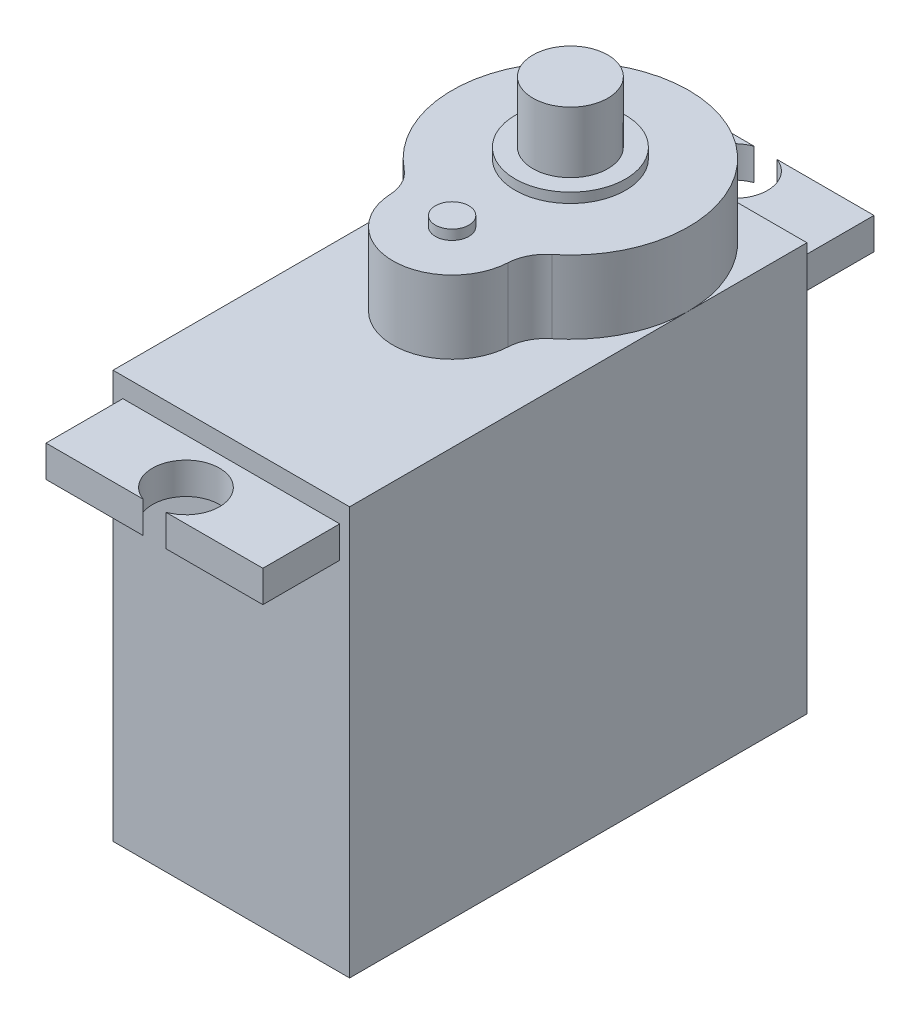
ISO-10303-21;
HEADER;
FILE_DESCRIPTION(('STEP AP214'),'2;1');
FILE_NAME('part.step','',(''),(''),'','','');
FILE_SCHEMA(('AUTOMOTIVE_DESIGN { 1 0 10303 214 1 1 1 1 }'));
ENDSEC;
DATA;
#1=APPLICATION_CONTEXT('core data for automotive mechanical design processes');
#2=APPLICATION_PROTOCOL_DEFINITION('international standard','automotive_design',2000,#1);
#3=PRODUCT_CONTEXT('',#1,'mechanical');
#4=PRODUCT('Part','Part','',(#3));
#5=PRODUCT_RELATED_PRODUCT_CATEGORY('part','',(#4));
#6=PRODUCT_DEFINITION_FORMATION('','',#4);
#7=PRODUCT_DEFINITION_CONTEXT('part definition',#1,'design');
#8=PRODUCT_DEFINITION('design','',#6,#7);
#9=PRODUCT_DEFINITION_SHAPE('','',#8);
#10=(LENGTH_UNIT() NAMED_UNIT(*) SI_UNIT(.MILLI.,.METRE.));
#11=(NAMED_UNIT(*) PLANE_ANGLE_UNIT() SI_UNIT($,.RADIAN.));
#12=(NAMED_UNIT(*) SI_UNIT($,.STERADIAN.) SOLID_ANGLE_UNIT());
#13=UNCERTAINTY_MEASURE_WITH_UNIT(LENGTH_MEASURE(1.E-05),#10,'distance_accuracy_value','');
#14=(GEOMETRIC_REPRESENTATION_CONTEXT(3) GLOBAL_UNCERTAINTY_ASSIGNED_CONTEXT((#13)) GLOBAL_UNIT_ASSIGNED_CONTEXT((#10,
#11,#12)) REPRESENTATION_CONTEXT('',''));
#15=CARTESIAN_POINT('',(0.,0.,0.));
#16=DIRECTION('',(0.,0.,1.));
#17=DIRECTION('',(1.,0.,0.));
#18=AXIS2_PLACEMENT_3D('',#15,#16,#17);
#19=CARTESIAN_POINT('',(4.98,4.2,-26.2));
#20=DIRECTION('',(0.,0.,-1.));
#21=DIRECTION('',(-1.,0.,0.));
#22=AXIS2_PLACEMENT_3D('',#19,#20,#21);
#23=PLANE('',#22);
#24=CARTESIAN_POINT('',(4.98,4.2,-26.2));
#25=DIRECTION('',(0.,0.,-1.));
#26=DIRECTION('',(-1.,0.,0.));
#27=AXIS2_PLACEMENT_3D('',#24,#25,#26);
#28=CIRCLE('',#27,0.500000000000002);
#29=CARTESIAN_POINT('',(4.48,4.2,-26.2));
#30=VERTEX_POINT('',#29);
#31=EDGE_CURVE('E11',#30,#30,#28,.T.);
#32=ORIENTED_EDGE('',*,*,#31,.T.);
#33=EDGE_LOOP('',(#32));
#34=FACE_BOUND('',#33,.T.);
#35=ADVANCED_FACE('F33',(#34),#23,.T.);
#36=CARTESIAN_POINT('',(4.98,4.2,-26.2));
#37=DIRECTION('',(0.,0.,1.));
#38=DIRECTION('',(1.,0.,0.));
#39=AXIS2_PLACEMENT_3D('',#36,#37,#38);
#40=CYLINDRICAL_SURFACE('',#39,0.500000000000002);
#41=ORIENTED_EDGE('',*,*,#31,.F.);
#42=EDGE_LOOP('',(#41));
#43=FACE_BOUND('',#42,.T.);
#44=CARTESIAN_POINT('',(4.98,4.2,-23.2));
#45=DIRECTION('',(0.,0.,1.));
#46=DIRECTION('',(1.,0.,0.));
#47=AXIS2_PLACEMENT_3D('',#44,#45,#46);
#48=CIRCLE('',#47,0.500000000000002);
#49=CARTESIAN_POINT('',(5.48,4.2,-23.2));
#50=VERTEX_POINT('',#49);
#51=EDGE_CURVE('E40',#50,#50,#48,.F.);
#52=ORIENTED_EDGE('',*,*,#51,.T.);
#53=EDGE_LOOP('',(#52));
#54=FACE_BOUND('',#53,.T.);
#55=ADVANCED_FACE('F298',(#43,#54),#40,.T.);
#56=CARTESIAN_POINT('',(0.,0.,3.9));
#57=DIRECTION('',(0.,0.,1.));
#58=DIRECTION('',(1.,0.,0.));
#59=AXIS2_PLACEMENT_3D('',#56,#57,#58);
#60=PLANE('',#59);
#61=DIRECTION('',(0.,1.,0.));
#62=VECTOR('',#61,1.);
#63=CARTESIAN_POINT('',(6.5744562646538,19.7,3.9));
#64=LINE('',#63,#62);
#65=CARTESIAN_POINT('',(6.5744562646538,18.1,3.9));
#66=VERTEX_POINT('',#65);
#67=CARTESIAN_POINT('',(6.5744562646538,19.7,3.9));
#68=VERTEX_POINT('',#67);
#69=EDGE_CURVE('E47',#66,#68,#64,.T.);
#70=ORIENTED_EDGE('',*,*,#69,.F.);
#71=DIRECTION('',(1.,0.,0.));
#72=VECTOR('',#71,1.);
#73=CARTESIAN_POINT('',(0.5,18.1,3.9));
#74=LINE('',#73,#72);
#75=CARTESIAN_POINT('',(11.5,18.1,3.9));
#76=VERTEX_POINT('',#75);
#77=EDGE_CURVE('E410',#66,#76,#74,.T.);
#78=ORIENTED_EDGE('',*,*,#77,.T.);
#79=DIRECTION('',(0.,1.,0.));
#80=VECTOR('',#79,1.);
#81=CARTESIAN_POINT('',(11.5,19.7,3.9));
#82=LINE('',#81,#80);
#83=CARTESIAN_POINT('',(11.5,19.7,3.9));
#84=VERTEX_POINT('',#83);
#85=EDGE_CURVE('E201',#76,#84,#82,.T.);
#86=ORIENTED_EDGE('',*,*,#85,.T.);
#87=DIRECTION('',(-1.,0.,0.));
#88=VECTOR('',#87,1.);
#89=CARTESIAN_POINT('',(0.5,19.7,3.9));
#90=LINE('',#89,#88);
#91=EDGE_CURVE('E200',#84,#68,#90,.T.);
#92=ORIENTED_EDGE('',*,*,#91,.T.);
#93=EDGE_LOOP('',(#70,#78,#86,#92));
#94=FACE_BOUND('',#93,.T.);
#95=ADVANCED_FACE('F326',(#94),#60,.T.);
#96=CARTESIAN_POINT('',(0.5,19.7,3.9));
#97=DIRECTION('',(0.,-1.,0.));
#98=DIRECTION('',(0.,0.,-1.));
#99=AXIS2_PLACEMENT_3D('',#96,#97,#98);
#100=PLANE('',#99);
#101=CARTESIAN_POINT('',(6.,19.7,2.3));
#102=DIRECTION('',(0.,1.,0.));
#103=DIRECTION('',(0.,0.,1.));
#104=AXIS2_PLACEMENT_3D('',#101,#102,#103);
#105=CIRCLE('',#104,1.7);
#106=CARTESIAN_POINT('',(5.4255437353462,19.7,3.9));
#107=VERTEX_POINT('',#106);
#108=EDGE_CURVE('E175',#68,#107,#105,.T.);
#109=ORIENTED_EDGE('',*,*,#108,.F.);
#110=ORIENTED_EDGE('',*,*,#91,.F.);
#111=DIRECTION('',(0.,0.,-1.));
#112=VECTOR('',#111,1.);
#113=CARTESIAN_POINT('',(11.5,19.7,3.9));
#114=LINE('',#113,#112);
#115=CARTESIAN_POINT('',(11.5,19.7,0.));
#116=VERTEX_POINT('',#115);
#117=EDGE_CURVE('E220',#84,#116,#114,.T.);
#118=ORIENTED_EDGE('',*,*,#117,.T.);
#119=DIRECTION('',(-1.,0.,0.));
#120=VECTOR('',#119,1.);
#121=CARTESIAN_POINT('',(0.5,19.7,0.));
#122=LINE('',#121,#120);
#123=CARTESIAN_POINT('',(0.5,19.7,0.));
#124=VERTEX_POINT('',#123);
#125=EDGE_CURVE('E216',#116,#124,#122,.T.);
#126=ORIENTED_EDGE('',*,*,#125,.T.);
#127=DIRECTION('',(0.,0.,-1.));
#128=VECTOR('',#127,1.);
#129=CARTESIAN_POINT('',(0.5,19.7,3.9));
#130=LINE('',#129,#128);
#131=CARTESIAN_POINT('',(0.5,19.7,3.9));
#132=VERTEX_POINT('',#131);
#133=EDGE_CURVE('E198',#132,#124,#130,.T.);
#134=ORIENTED_EDGE('',*,*,#133,.F.);
#135=EDGE_CURVE('E191',#107,#132,#90,.T.);
#136=ORIENTED_EDGE('',*,*,#135,.F.);
#137=EDGE_LOOP('',(#109,#110,#118,#126,#134,#136));
#138=FACE_BOUND('',#137,.T.);
#139=ADVANCED_FACE('F195',(#138),#100,.F.);
#140=CARTESIAN_POINT('',(0.,0.,-27.1));
#141=DIRECTION('',(0.,0.,-1.));
#142=DIRECTION('',(-1.,0.,0.));
#143=AXIS2_PLACEMENT_3D('',#140,#141,#142);
#144=PLANE('',#143);
#145=DIRECTION('',(0.,1.,0.));
#146=VECTOR('',#145,1.);
#147=CARTESIAN_POINT('',(5.4255437353462,19.7,-27.1));
#148=LINE('',#147,#146);
#149=CARTESIAN_POINT('',(5.4255437353462,18.1,-27.1));
#150=VERTEX_POINT('',#149);
#151=CARTESIAN_POINT('',(5.4255437353462,19.7,-27.1));
#152=VERTEX_POINT('',#151);
#153=EDGE_CURVE('E55',#150,#152,#148,.T.);
#154=ORIENTED_EDGE('',*,*,#153,.F.);
#155=DIRECTION('',(-1.,0.,0.));
#156=VECTOR('',#155,1.);
#157=CARTESIAN_POINT('',(11.5,18.1,-27.1));
#158=LINE('',#157,#156);
#159=CARTESIAN_POINT('',(0.5,18.1,-27.1));
#160=VERTEX_POINT('',#159);
#161=EDGE_CURVE('E444',#150,#160,#158,.T.);
#162=ORIENTED_EDGE('',*,*,#161,.T.);
#163=DIRECTION('',(0.,1.,0.));
#164=VECTOR('',#163,1.);
#165=CARTESIAN_POINT('',(0.5,19.7,-27.1));
#166=LINE('',#165,#164);
#167=CARTESIAN_POINT('',(0.5,19.7,-27.1));
#168=VERTEX_POINT('',#167);
#169=EDGE_CURVE('E440',#160,#168,#166,.T.);
#170=ORIENTED_EDGE('',*,*,#169,.T.);
#171=DIRECTION('',(1.,0.,0.));
#172=VECTOR('',#171,1.);
#173=CARTESIAN_POINT('',(11.5,19.7,-27.1));
#174=LINE('',#173,#172);
#175=EDGE_CURVE('E424',#168,#152,#174,.T.);
#176=ORIENTED_EDGE('',*,*,#175,.T.);
#177=EDGE_LOOP('',(#154,#162,#170,#176));
#178=FACE_BOUND('',#177,.T.);
#179=ADVANCED_FACE('F452',(#178),#144,.T.);
#180=CARTESIAN_POINT('',(11.5,19.7,-27.1));
#181=DIRECTION('',(0.,-1.,0.));
#182=DIRECTION('',(0.,0.,-1.));
#183=AXIS2_PLACEMENT_3D('',#180,#181,#182);
#184=PLANE('',#183);
#185=CARTESIAN_POINT('',(6.,19.7,-25.5));
#186=DIRECTION('',(0.,1.,0.));
#187=DIRECTION('',(0.,0.,1.));
#188=AXIS2_PLACEMENT_3D('',#185,#186,#187);
#189=CIRCLE('',#188,1.7);
#190=CARTESIAN_POINT('',(6.5744562646538,19.7,-27.1));
#191=VERTEX_POINT('',#190);
#192=EDGE_CURVE('E287',#152,#191,#189,.T.);
#193=ORIENTED_EDGE('',*,*,#192,.F.);
#194=ORIENTED_EDGE('',*,*,#175,.F.);
#195=DIRECTION('',(0.,0.,1.));
#196=VECTOR('',#195,1.);
#197=CARTESIAN_POINT('',(0.5,19.7,-27.1));
#198=LINE('',#197,#196);
#199=CARTESIAN_POINT('',(0.5,19.7,-23.2));
#200=VERTEX_POINT('',#199);
#201=EDGE_CURVE('E418',#168,#200,#198,.T.);
#202=ORIENTED_EDGE('',*,*,#201,.T.);
#203=DIRECTION('',(1.,0.,0.));
#204=VECTOR('',#203,1.);
#205=CARTESIAN_POINT('',(11.5,19.7,-23.2));
#206=LINE('',#205,#204);
#207=CARTESIAN_POINT('',(11.5,19.7,-23.2));
#208=VERTEX_POINT('',#207);
#209=EDGE_CURVE('E425',#200,#208,#206,.T.);
#210=ORIENTED_EDGE('',*,*,#209,.T.);
#211=DIRECTION('',(0.,0.,1.));
#212=VECTOR('',#211,1.);
#213=CARTESIAN_POINT('',(11.5,19.7,-27.1));
#214=LINE('',#213,#212);
#215=CARTESIAN_POINT('',(11.5,19.7,-27.1));
#216=VERTEX_POINT('',#215);
#217=EDGE_CURVE('E421',#216,#208,#214,.T.);
#218=ORIENTED_EDGE('',*,*,#217,.F.);
#219=EDGE_CURVE('E439',#191,#216,#174,.T.);
#220=ORIENTED_EDGE('',*,*,#219,.F.);
#221=EDGE_LOOP('',(#193,#194,#202,#210,#218,#220));
#222=FACE_BOUND('',#221,.T.);
#223=ADVANCED_FACE('F462',(#222),#184,.F.);
#224=CARTESIAN_POINT('',(6.,24.4,-17.2));
#225=DIRECTION('',(0.,-1.,0.));
#226=DIRECTION('',(0.,0.,-1.));
#227=AXIS2_PLACEMENT_3D('',#224,#225,#226);
#228=CYLINDRICAL_SURFACE('',#227,6.);
#229=CARTESIAN_POINT('',(6.,20.7,-17.2));
#230=DIRECTION('',(0.,1.,0.));
#231=DIRECTION('',(0.,0.,1.));
#232=AXIS2_PLACEMENT_3D('',#229,#230,#231);
#233=CIRCLE('',#232,6.);
#234=CARTESIAN_POINT('',(0.,20.7,-17.2));
#235=VERTEX_POINT('',#234);
#236=CARTESIAN_POINT('',(2.25469043335534,20.7,-12.5125));
#237=VERTEX_POINT('',#236);
#238=EDGE_CURVE('E383',#235,#237,#233,.T.);
#239=ORIENTED_EDGE('',*,*,#238,.T.);
#240=DIRECTION('',(0.,-1.,0.));
#241=VECTOR('',#240,1.);
#242=CARTESIAN_POINT('',(2.25469043335534,24.4,-12.5125));
#243=LINE('',#242,#241);
#244=CARTESIAN_POINT('',(2.25469043335534,24.4,-12.5125));
#245=VERTEX_POINT('',#244);
#246=EDGE_CURVE('E278',#237,#245,#243,.F.);
#247=ORIENTED_EDGE('',*,*,#246,.T.);
#248=CARTESIAN_POINT('',(6.,24.4,-17.2));
#249=DIRECTION('',(0.,1.,0.));
#250=DIRECTION('',(0.,0.,1.));
#251=AXIS2_PLACEMENT_3D('',#248,#249,#250);
#252=CIRCLE('',#251,6.);
#253=CARTESIAN_POINT('',(9.74530956664466,24.4,-12.5125));
#254=VERTEX_POINT('',#253);
#255=EDGE_CURVE('E380',#254,#245,#252,.T.);
#256=ORIENTED_EDGE('',*,*,#255,.F.);
#257=DIRECTION('',(0.,-1.,0.));
#258=VECTOR('',#257,1.);
#259=CARTESIAN_POINT('',(9.74530956664466,24.4,-12.5125));
#260=LINE('',#259,#258);
#261=CARTESIAN_POINT('',(9.74530956664466,20.7,-12.5125));
#262=VERTEX_POINT('',#261);
#263=EDGE_CURVE('E276',#254,#262,#260,.T.);
#264=ORIENTED_EDGE('',*,*,#263,.T.);
#265=CARTESIAN_POINT('',(12.,20.7,-17.2));
#266=VERTEX_POINT('',#265);
#267=EDGE_CURVE('E264',#262,#266,#233,.T.);
#268=ORIENTED_EDGE('',*,*,#267,.T.);
#269=CARTESIAN_POINT('',(6.,20.7,-23.2));
#270=VERTEX_POINT('',#269);
#271=EDGE_CURVE('E374',#266,#270,#233,.T.);
#272=ORIENTED_EDGE('',*,*,#271,.T.);
#273=EDGE_CURVE('E269',#270,#235,#233,.T.);
#274=ORIENTED_EDGE('',*,*,#273,.T.);
#275=EDGE_LOOP('',(#239,#247,#256,#264,#268,#272,#274));
#276=FACE_BOUND('',#275,.T.);
#277=ADVANCED_FACE('F378',(#276),#228,.T.);
#278=CARTESIAN_POINT('',(0.,20.7,0.));
#279=DIRECTION('',(0.,-1.,0.));
#280=DIRECTION('',(0.,0.,-1.));
#281=AXIS2_PLACEMENT_3D('',#278,#279,#280);
#282=PLANE('',#281);
#283=ORIENTED_EDGE('',*,*,#271,.F.);
#284=DIRECTION('',(0.,0.,-1.));
#285=VECTOR('',#284,1.);
#286=CARTESIAN_POINT('',(12.,20.7,0.));
#287=LINE('',#286,#285);
#288=CARTESIAN_POINT('',(12.,20.7,-23.2));
#289=VERTEX_POINT('',#288);
#290=EDGE_CURVE('E236',#266,#289,#287,.T.);
#291=ORIENTED_EDGE('',*,*,#290,.T.);
#292=DIRECTION('',(-1.,0.,0.));
#293=VECTOR('',#292,1.);
#294=CARTESIAN_POINT('',(0.,20.7,-23.2));
#295=LINE('',#294,#293);
#296=EDGE_CURVE('E241',#289,#270,#295,.T.);
#297=ORIENTED_EDGE('',*,*,#296,.T.);
#298=EDGE_LOOP('',(#283,#291,#297));
#299=FACE_BOUND('',#298,.T.);
#300=ADVANCED_FACE('F313',(#299),#282,.F.);
#301=ORIENTED_EDGE('',*,*,#273,.F.);
#302=CARTESIAN_POINT('',(0.,20.7,-23.2));
#303=VERTEX_POINT('',#302);
#304=EDGE_CURVE('E240',#270,#303,#295,.T.);
#305=ORIENTED_EDGE('',*,*,#304,.T.);
#306=DIRECTION('',(0.,0.,1.));
#307=VECTOR('',#306,1.);
#308=CARTESIAN_POINT('',(0.,20.7,0.));
#309=LINE('',#308,#307);
#310=EDGE_CURVE('E230',#303,#235,#309,.T.);
#311=ORIENTED_EDGE('',*,*,#310,.T.);
#312=EDGE_LOOP('',(#301,#305,#311));
#313=FACE_BOUND('',#312,.T.);
#314=ADVANCED_FACE('F303',(#313),#282,.F.);
#315=CARTESIAN_POINT('',(0.,20.7,-23.2));
#316=DIRECTION('',(0.,0.,1.));
#317=DIRECTION('',(1.,0.,0.));
#318=AXIS2_PLACEMENT_3D('',#315,#316,#317);
#319=PLANE('',#318);
#320=CARTESIAN_POINT('',(5.99,4.2,-23.2));
#321=DIRECTION('',(0.,0.,1.));
#322=DIRECTION('',(1.,0.,0.));
#323=AXIS2_PLACEMENT_3D('',#320,#321,#322);
#324=CIRCLE('',#323,0.500000000000002);
#325=CARTESIAN_POINT('',(6.49,4.2,-23.2));
#326=VERTEX_POINT('',#325);
#327=EDGE_CURVE('E293',#326,#326,#324,.F.);
#328=ORIENTED_EDGE('',*,*,#327,.F.);
#329=EDGE_LOOP('',(#328));
#330=FACE_BOUND('',#329,.T.);
#331=CARTESIAN_POINT('',(7.,4.2,-23.2));
#332=DIRECTION('',(0.,0.,1.));
#333=DIRECTION('',(1.,0.,0.));
#334=AXIS2_PLACEMENT_3D('',#331,#332,#333);
#335=CIRCLE('',#334,0.500000000000002);
#336=CARTESIAN_POINT('',(7.5,4.2,-23.2));
#337=VERTEX_POINT('',#336);
#338=EDGE_CURVE('E290',#337,#337,#335,.F.);
#339=ORIENTED_EDGE('',*,*,#338,.F.);
#340=EDGE_LOOP('',(#339));
#341=FACE_BOUND('',#340,.T.);
#342=DIRECTION('',(-1.,0.,0.));
#343=VECTOR('',#342,1.);
#344=CARTESIAN_POINT('',(0.,0.,-23.2));
#345=LINE('',#344,#343);
#346=CARTESIAN_POINT('',(12.,0.,-23.2));
#347=VERTEX_POINT('',#346);
#348=CARTESIAN_POINT('',(0.,0.,-23.2));
#349=VERTEX_POINT('',#348);
#350=EDGE_CURVE('E251',#347,#349,#345,.T.);
#351=ORIENTED_EDGE('',*,*,#350,.T.);
#352=DIRECTION('',(0.,-1.,0.));
#353=VECTOR('',#352,1.);
#354=CARTESIAN_POINT('',(0.,20.7,-23.2));
#355=LINE('',#354,#353);
#356=EDGE_CURVE('E244',#303,#349,#355,.T.);
#357=ORIENTED_EDGE('',*,*,#356,.F.);
#358=ORIENTED_EDGE('',*,*,#304,.F.);
#359=ORIENTED_EDGE('',*,*,#296,.F.);
#360=DIRECTION('',(0.,-1.,0.));
#361=VECTOR('',#360,1.);
#362=CARTESIAN_POINT('',(12.,20.7,-23.2));
#363=LINE('',#362,#361);
#364=EDGE_CURVE('E255',#289,#347,#363,.T.);
#365=ORIENTED_EDGE('',*,*,#364,.T.);
#366=EDGE_LOOP('',(#351,#357,#358,#359,#365));
#367=FACE_BOUND('',#366,.T.);
#368=DIRECTION('',(0.,-1.,0.));
#369=VECTOR('',#368,1.);
#370=CARTESIAN_POINT('',(11.5,19.7,-23.2));
#371=LINE('',#370,#369);
#372=CARTESIAN_POINT('',(11.5,18.1,-23.2));
#373=VERTEX_POINT('',#372);
#374=EDGE_CURVE('E385',#208,#373,#371,.T.);
#375=ORIENTED_EDGE('',*,*,#374,.F.);
#376=ORIENTED_EDGE('',*,*,#209,.F.);
#377=DIRECTION('',(0.,1.,0.));
#378=VECTOR('',#377,1.);
#379=CARTESIAN_POINT('',(0.5,19.7,-23.2));
#380=LINE('',#379,#378);
#381=CARTESIAN_POINT('',(0.5,18.1,-23.2));
#382=VERTEX_POINT('',#381);
#383=EDGE_CURVE('E429',#382,#200,#380,.T.);
#384=ORIENTED_EDGE('',*,*,#383,.F.);
#385=DIRECTION('',(-1.,0.,0.));
#386=VECTOR('',#385,1.);
#387=CARTESIAN_POINT('',(11.5,18.1,-23.2));
#388=LINE('',#387,#386);
#389=EDGE_CURVE('E432',#373,#382,#388,.T.);
#390=ORIENTED_EDGE('',*,*,#389,.F.);
#391=EDGE_LOOP('',(#375,#376,#384,#390));
#392=FACE_BOUND('',#391,.T.);
#393=ORIENTED_EDGE('',*,*,#51,.F.);
#394=EDGE_LOOP('',(#393));
#395=FACE_BOUND('',#394,.T.);
#396=ADVANCED_FACE('F300',(#330,#341,#367,#392,#395),#319,.F.);
#397=CARTESIAN_POINT('',(0.,20.7,0.));
#398=DIRECTION('',(0.,0.,-1.));
#399=DIRECTION('',(-1.,0.,0.));
#400=AXIS2_PLACEMENT_3D('',#397,#398,#399);
#401=PLANE('',#400);
#402=DIRECTION('',(1.,0.,0.));
#403=VECTOR('',#402,1.);
#404=CARTESIAN_POINT('',(0.,0.,0.));
#405=LINE('',#404,#403);
#406=CARTESIAN_POINT('',(0.,0.,0.));
#407=VERTEX_POINT('',#406);
#408=CARTESIAN_POINT('',(12.,0.,0.));
#409=VERTEX_POINT('',#408);
#410=EDGE_CURVE('E247',#407,#409,#405,.T.);
#411=ORIENTED_EDGE('',*,*,#410,.T.);
#412=DIRECTION('',(0.,-1.,0.));
#413=VECTOR('',#412,1.);
#414=CARTESIAN_POINT('',(12.,20.7,0.));
#415=LINE('',#414,#413);
#416=CARTESIAN_POINT('',(12.,20.7,0.));
#417=VERTEX_POINT('',#416);
#418=EDGE_CURVE('E258',#417,#409,#415,.T.);
#419=ORIENTED_EDGE('',*,*,#418,.F.);
#420=DIRECTION('',(1.,0.,0.));
#421=VECTOR('',#420,1.);
#422=CARTESIAN_POINT('',(0.,20.7,0.));
#423=LINE('',#422,#421);
#424=CARTESIAN_POINT('',(0.,20.7,0.));
#425=VERTEX_POINT('',#424);
#426=EDGE_CURVE('E233',#425,#417,#423,.T.);
#427=ORIENTED_EDGE('',*,*,#426,.F.);
#428=DIRECTION('',(0.,-1.,0.));
#429=VECTOR('',#428,1.);
#430=CARTESIAN_POINT('',(0.,20.7,0.));
#431=LINE('',#430,#429);
#432=EDGE_CURVE('E261',#425,#407,#431,.T.);
#433=ORIENTED_EDGE('',*,*,#432,.T.);
#434=EDGE_LOOP('',(#411,#419,#427,#433));
#435=FACE_BOUND('',#434,.T.);
#436=DIRECTION('',(0.,-1.,0.));
#437=VECTOR('',#436,1.);
#438=CARTESIAN_POINT('',(0.5,19.7,0.));
#439=LINE('',#438,#437);
#440=CARTESIAN_POINT('',(0.5,18.1,0.));
#441=VERTEX_POINT('',#440);
#442=EDGE_CURVE('E206',#124,#441,#439,.T.);
#443=ORIENTED_EDGE('',*,*,#442,.F.);
#444=ORIENTED_EDGE('',*,*,#125,.F.);
#445=DIRECTION('',(0.,1.,0.));
#446=VECTOR('',#445,1.);
#447=CARTESIAN_POINT('',(11.5,19.7,0.));
#448=LINE('',#447,#446);
#449=CARTESIAN_POINT('',(11.5,18.1,0.));
#450=VERTEX_POINT('',#449);
#451=EDGE_CURVE('E213',#450,#116,#448,.T.);
#452=ORIENTED_EDGE('',*,*,#451,.F.);
#453=DIRECTION('',(1.,0.,0.));
#454=VECTOR('',#453,1.);
#455=CARTESIAN_POINT('',(0.5,18.1,0.));
#456=LINE('',#455,#454);
#457=EDGE_CURVE('E209',#441,#450,#456,.T.);
#458=ORIENTED_EDGE('',*,*,#457,.F.);
#459=EDGE_LOOP('',(#443,#444,#452,#458));
#460=FACE_BOUND('',#459,.T.);
#461=ADVANCED_FACE('F302',(#435,#460),#401,.F.);
#462=CARTESIAN_POINT('',(0.,20.7,0.));
#463=DIRECTION('',(1.,0.,0.));
#464=DIRECTION('',(0.,0.,-1.));
#465=AXIS2_PLACEMENT_3D('',#462,#463,#464);
#466=PLANE('',#465);
#467=DIRECTION('',(0.,0.,1.));
#468=VECTOR('',#467,1.);
#469=CARTESIAN_POINT('',(0.,0.,0.));
#470=LINE('',#469,#468);
#471=EDGE_CURVE('E229',#349,#407,#470,.T.);
#472=ORIENTED_EDGE('',*,*,#471,.T.);
#473=ORIENTED_EDGE('',*,*,#432,.F.);
#474=EDGE_CURVE('E234',#235,#425,#309,.T.);
#475=ORIENTED_EDGE('',*,*,#474,.F.);
#476=ORIENTED_EDGE('',*,*,#310,.F.);
#477=ORIENTED_EDGE('',*,*,#356,.T.);
#478=EDGE_LOOP('',(#472,#473,#475,#476,#477));
#479=FACE_BOUND('',#478,.T.);
#480=ADVANCED_FACE('F310',(#479),#466,.F.);
#481=CARTESIAN_POINT('',(12.,20.7,0.));
#482=DIRECTION('',(-1.,0.,0.));
#483=DIRECTION('',(0.,0.,1.));
#484=AXIS2_PLACEMENT_3D('',#481,#482,#483);
#485=PLANE('',#484);
#486=DIRECTION('',(0.,0.,-1.));
#487=VECTOR('',#486,1.);
#488=CARTESIAN_POINT('',(12.,0.,0.));
#489=LINE('',#488,#487);
#490=EDGE_CURVE('E249',#409,#347,#489,.T.);
#491=ORIENTED_EDGE('',*,*,#490,.T.);
#492=ORIENTED_EDGE('',*,*,#364,.F.);
#493=ORIENTED_EDGE('',*,*,#290,.F.);
#494=EDGE_CURVE('E237',#417,#266,#287,.T.);
#495=ORIENTED_EDGE('',*,*,#494,.F.);
#496=ORIENTED_EDGE('',*,*,#418,.T.);
#497=EDGE_LOOP('',(#491,#492,#493,#495,#496));
#498=FACE_BOUND('',#497,.T.);
#499=ADVANCED_FACE('F346',(#498),#485,.F.);
#500=CARTESIAN_POINT('',(6.,20.7,-11.2));
#501=DIRECTION('',(0.,1.,0.));
#502=DIRECTION('',(0.,0.,1.));
#503=AXIS2_PLACEMENT_3D('',#500,#501,#502);
#504=CIRCLE('',#503,3.);
#505=CARTESIAN_POINT('',(3.00375234668427,20.7,-11.05));
#506=VERTEX_POINT('',#505);
#507=CARTESIAN_POINT('',(8.99624765331573,20.7,-11.05));
#508=VERTEX_POINT('',#507);
#509=EDGE_CURVE('E388',#506,#508,#504,.T.);
#510=ORIENTED_EDGE('',*,*,#509,.F.);
#511=CARTESIAN_POINT('',(1.00625391114045,20.7,-10.95));
#512=DIRECTION('',(0.,-1.,0.));
#513=DIRECTION('',(0.,0.,-1.));
#514=AXIS2_PLACEMENT_3D('',#511,#512,#513);
#515=CIRCLE('',#514,2.);
#516=EDGE_CURVE('E274',#506,#237,#515,.F.);
#517=ORIENTED_EDGE('',*,*,#516,.T.);
#518=ORIENTED_EDGE('',*,*,#238,.F.);
#519=ORIENTED_EDGE('',*,*,#474,.T.);
#520=ORIENTED_EDGE('',*,*,#426,.T.);
#521=ORIENTED_EDGE('',*,*,#494,.T.);
#522=ORIENTED_EDGE('',*,*,#267,.F.);
#523=CARTESIAN_POINT('',(10.9937460888595,20.7,-10.95));
#524=DIRECTION('',(0.,-1.,0.));
#525=DIRECTION('',(0.,0.,-1.));
#526=AXIS2_PLACEMENT_3D('',#523,#524,#525);
#527=CIRCLE('',#526,2.);
#528=EDGE_CURVE('E272',#262,#508,#527,.F.);
#529=ORIENTED_EDGE('',*,*,#528,.T.);
#530=EDGE_LOOP('',(#510,#517,#518,#519,#520,#521,#522,#529));
#531=FACE_BOUND('',#530,.T.);
#532=ADVANCED_FACE('F316',(#531),#282,.F.);
#533=CARTESIAN_POINT('',(0.,0.,0.));
#534=DIRECTION('',(0.,-1.,0.));
#535=DIRECTION('',(0.,0.,-1.));
#536=AXIS2_PLACEMENT_3D('',#533,#534,#535);
#537=PLANE('',#536);
#538=ORIENTED_EDGE('',*,*,#471,.F.);
#539=ORIENTED_EDGE('',*,*,#350,.F.);
#540=ORIENTED_EDGE('',*,*,#490,.F.);
#541=ORIENTED_EDGE('',*,*,#410,.F.);
#542=EDGE_LOOP('',(#538,#539,#540,#541));
#543=FACE_BOUND('',#542,.T.);
#544=ADVANCED_FACE('F353',(#543),#537,.T.);
#545=CARTESIAN_POINT('',(0.5,19.7,3.9));
#546=DIRECTION('',(1.,0.,0.));
#547=DIRECTION('',(0.,1.,0.));
#548=AXIS2_PLACEMENT_3D('',#545,#546,#547);
#549=PLANE('',#548);
#550=ORIENTED_EDGE('',*,*,#442,.T.);
#551=DIRECTION('',(0.,0.,-1.));
#552=VECTOR('',#551,1.);
#553=CARTESIAN_POINT('',(0.5,18.1,3.9));
#554=LINE('',#553,#552);
#555=CARTESIAN_POINT('',(0.5,18.1,3.9));
#556=VERTEX_POINT('',#555);
#557=EDGE_CURVE('E226',#556,#441,#554,.T.);
#558=ORIENTED_EDGE('',*,*,#557,.F.);
#559=DIRECTION('',(0.,-1.,0.));
#560=VECTOR('',#559,1.);
#561=CARTESIAN_POINT('',(0.5,19.7,3.9));
#562=LINE('',#561,#560);
#563=EDGE_CURVE('E218',#132,#556,#562,.T.);
#564=ORIENTED_EDGE('',*,*,#563,.F.);
#565=ORIENTED_EDGE('',*,*,#133,.T.);
#566=EDGE_LOOP('',(#550,#558,#564,#565));
#567=FACE_BOUND('',#566,.T.);
#568=ADVANCED_FACE('F409',(#567),#549,.F.);
#569=CARTESIAN_POINT('',(0.5,18.1,3.9));
#570=DIRECTION('',(0.,1.,0.));
#571=DIRECTION('',(0.,0.,1.));
#572=AXIS2_PLACEMENT_3D('',#569,#570,#571);
#573=PLANE('',#572);
#574=ORIENTED_EDGE('',*,*,#77,.F.);
#575=CARTESIAN_POINT('',(6.,18.1,2.3));
#576=DIRECTION('',(0.,1.,0.));
#577=DIRECTION('',(0.,0.,1.));
#578=AXIS2_PLACEMENT_3D('',#575,#576,#577);
#579=CIRCLE('',#578,1.7);
#580=CARTESIAN_POINT('',(5.4255437353462,18.1,3.9));
#581=VERTEX_POINT('',#580);
#582=EDGE_CURVE('E184',#66,#581,#579,.T.);
#583=ORIENTED_EDGE('',*,*,#582,.T.);
#584=EDGE_CURVE('E193',#556,#581,#74,.T.);
#585=ORIENTED_EDGE('',*,*,#584,.F.);
#586=ORIENTED_EDGE('',*,*,#557,.T.);
#587=ORIENTED_EDGE('',*,*,#457,.T.);
#588=DIRECTION('',(0.,0.,-1.));
#589=VECTOR('',#588,1.);
#590=CARTESIAN_POINT('',(11.5,18.1,3.9));
#591=LINE('',#590,#589);
#592=EDGE_CURVE('E223',#76,#450,#591,.T.);
#593=ORIENTED_EDGE('',*,*,#592,.F.);
#594=EDGE_LOOP('',(#574,#583,#585,#586,#587,#593));
#595=FACE_BOUND('',#594,.T.);
#596=ADVANCED_FACE('F522',(#595),#573,.F.);
#597=CARTESIAN_POINT('',(11.5,19.7,3.9));
#598=DIRECTION('',(-1.,0.,0.));
#599=DIRECTION('',(0.,0.,1.));
#600=AXIS2_PLACEMENT_3D('',#597,#598,#599);
#601=PLANE('',#600);
#602=ORIENTED_EDGE('',*,*,#451,.T.);
#603=ORIENTED_EDGE('',*,*,#117,.F.);
#604=ORIENTED_EDGE('',*,*,#85,.F.);
#605=ORIENTED_EDGE('',*,*,#592,.T.);
#606=EDGE_LOOP('',(#602,#603,#604,#605));
#607=FACE_BOUND('',#606,.T.);
#608=ADVANCED_FACE('F517',(#607),#601,.F.);
#609=DIRECTION('',(0.,1.,0.));
#610=VECTOR('',#609,1.);
#611=CARTESIAN_POINT('',(5.4255437353462,19.7,3.9));
#612=LINE('',#611,#610);
#613=EDGE_CURVE('E178',#107,#581,#612,.F.);
#614=ORIENTED_EDGE('',*,*,#613,.F.);
#615=ORIENTED_EDGE('',*,*,#135,.T.);
#616=ORIENTED_EDGE('',*,*,#563,.T.);
#617=ORIENTED_EDGE('',*,*,#584,.T.);
#618=EDGE_LOOP('',(#614,#615,#616,#617));
#619=FACE_BOUND('',#618,.T.);
#620=ADVANCED_FACE('F189',(#619),#60,.T.);
#621=CARTESIAN_POINT('',(11.5,19.7,-27.1));
#622=DIRECTION('',(-1.,0.,0.));
#623=DIRECTION('',(0.,0.,1.));
#624=AXIS2_PLACEMENT_3D('',#621,#622,#623);
#625=PLANE('',#624);
#626=ORIENTED_EDGE('',*,*,#374,.T.);
#627=DIRECTION('',(0.,0.,1.));
#628=VECTOR('',#627,1.);
#629=CARTESIAN_POINT('',(11.5,18.1,-27.1));
#630=LINE('',#629,#628);
#631=CARTESIAN_POINT('',(11.5,18.1,-27.1));
#632=VERTEX_POINT('',#631);
#633=EDGE_CURVE('E210',#632,#373,#630,.T.);
#634=ORIENTED_EDGE('',*,*,#633,.F.);
#635=DIRECTION('',(0.,-1.,0.));
#636=VECTOR('',#635,1.);
#637=CARTESIAN_POINT('',(11.5,19.7,-27.1));
#638=LINE('',#637,#636);
#639=EDGE_CURVE('E428',#216,#632,#638,.T.);
#640=ORIENTED_EDGE('',*,*,#639,.F.);
#641=ORIENTED_EDGE('',*,*,#217,.T.);
#642=EDGE_LOOP('',(#626,#634,#640,#641));
#643=FACE_BOUND('',#642,.T.);
#644=ADVANCED_FACE('F512',(#643),#625,.F.);
#645=CARTESIAN_POINT('',(11.5,18.1,-27.1));
#646=DIRECTION('',(0.,1.,0.));
#647=DIRECTION('',(0.,0.,1.));
#648=AXIS2_PLACEMENT_3D('',#645,#646,#647);
#649=PLANE('',#648);
#650=ORIENTED_EDGE('',*,*,#161,.F.);
#651=CARTESIAN_POINT('',(6.,18.1,-25.5));
#652=DIRECTION('',(0.,1.,0.));
#653=DIRECTION('',(0.,0.,1.));
#654=AXIS2_PLACEMENT_3D('',#651,#652,#653);
#655=CIRCLE('',#654,1.7);
#656=CARTESIAN_POINT('',(6.5744562646538,18.1,-27.1));
#657=VERTEX_POINT('',#656);
#658=EDGE_CURVE('E471',#150,#657,#655,.T.);
#659=ORIENTED_EDGE('',*,*,#658,.T.);
#660=EDGE_CURVE('E442',#632,#657,#158,.T.);
#661=ORIENTED_EDGE('',*,*,#660,.F.);
#662=ORIENTED_EDGE('',*,*,#633,.T.);
#663=ORIENTED_EDGE('',*,*,#389,.T.);
#664=DIRECTION('',(0.,0.,1.));
#665=VECTOR('',#664,1.);
#666=CARTESIAN_POINT('',(0.5,18.1,-27.1));
#667=LINE('',#666,#665);
#668=EDGE_CURVE('E415',#160,#382,#667,.T.);
#669=ORIENTED_EDGE('',*,*,#668,.F.);
#670=EDGE_LOOP('',(#650,#659,#661,#662,#663,#669));
#671=FACE_BOUND('',#670,.T.);
#672=ADVANCED_FACE('F457',(#671),#649,.F.);
#673=CARTESIAN_POINT('',(0.5,19.7,-27.1));
#674=DIRECTION('',(1.,0.,0.));
#675=DIRECTION('',(0.,0.,-1.));
#676=AXIS2_PLACEMENT_3D('',#673,#674,#675);
#677=PLANE('',#676);
#678=ORIENTED_EDGE('',*,*,#383,.T.);
#679=ORIENTED_EDGE('',*,*,#201,.F.);
#680=ORIENTED_EDGE('',*,*,#169,.F.);
#681=ORIENTED_EDGE('',*,*,#668,.T.);
#682=EDGE_LOOP('',(#678,#679,#680,#681));
#683=FACE_BOUND('',#682,.T.);
#684=ADVANCED_FACE('F459',(#683),#677,.F.);
#685=DIRECTION('',(0.,1.,0.));
#686=VECTOR('',#685,1.);
#687=CARTESIAN_POINT('',(6.5744562646538,19.7,-27.1));
#688=LINE('',#687,#686);
#689=EDGE_CURVE('E285',#191,#657,#688,.F.);
#690=ORIENTED_EDGE('',*,*,#689,.F.);
#691=ORIENTED_EDGE('',*,*,#219,.T.);
#692=ORIENTED_EDGE('',*,*,#639,.T.);
#693=ORIENTED_EDGE('',*,*,#660,.T.);
#694=EDGE_LOOP('',(#690,#691,#692,#693));
#695=FACE_BOUND('',#694,.T.);
#696=ADVANCED_FACE('F492',(#695),#144,.T.);
#697=CARTESIAN_POINT('',(6.,24.4,-17.2));
#698=DIRECTION('',(0.,1.,0.));
#699=DIRECTION('',(0.,0.,1.));
#700=AXIS2_PLACEMENT_3D('',#697,#698,#699);
#701=PLANE('',#700);
#702=CARTESIAN_POINT('',(6.,24.4,-17.2));
#703=DIRECTION('',(0.,1.,0.));
#704=DIRECTION('',(0.,0.,1.));
#705=AXIS2_PLACEMENT_3D('',#702,#703,#704);
#706=CIRCLE('',#705,2.8);
#707=CARTESIAN_POINT('',(6.,24.4,-14.4));
#708=VERTEX_POINT('',#707);
#709=EDGE_CURVE('E475',#708,#708,#706,.T.);
#710=ORIENTED_EDGE('',*,*,#709,.F.);
#711=EDGE_LOOP('',(#710));
#712=FACE_BOUND('',#711,.T.);
#713=CARTESIAN_POINT('',(6.,24.4,-11.2));
#714=DIRECTION('',(0.,1.,0.));
#715=DIRECTION('',(0.,0.,1.));
#716=AXIS2_PLACEMENT_3D('',#713,#714,#715);
#717=CIRCLE('',#716,0.85);
#718=CARTESIAN_POINT('',(6.,24.4,-10.35));
#719=VERTEX_POINT('',#718);
#720=EDGE_CURVE('E480',#719,#719,#717,.T.);
#721=ORIENTED_EDGE('',*,*,#720,.F.);
#722=EDGE_LOOP('',(#721));
#723=FACE_BOUND('',#722,.T.);
#724=CARTESIAN_POINT('',(6.,24.4,-11.2));
#725=DIRECTION('',(0.,1.,0.));
#726=DIRECTION('',(0.,0.,1.));
#727=AXIS2_PLACEMENT_3D('',#724,#725,#726);
#728=CIRCLE('',#727,3.);
#729=CARTESIAN_POINT('',(3.00375234668427,24.4,-11.05));
#730=VERTEX_POINT('',#729);
#731=CARTESIAN_POINT('',(8.99624765331573,24.4,-11.05));
#732=VERTEX_POINT('',#731);
#733=EDGE_CURVE('E381',#730,#732,#728,.T.);
#734=ORIENTED_EDGE('',*,*,#733,.T.);
#735=CARTESIAN_POINT('',(10.9937460888595,24.4,-10.95));
#736=DIRECTION('',(0.,1.,0.));
#737=DIRECTION('',(0.,0.,1.));
#738=AXIS2_PLACEMENT_3D('',#735,#736,#737);
#739=CIRCLE('',#738,2.);
#740=EDGE_CURVE('E282',#732,#254,#739,.F.);
#741=ORIENTED_EDGE('',*,*,#740,.T.);
#742=ORIENTED_EDGE('',*,*,#255,.T.);
#743=CARTESIAN_POINT('',(1.00625391114045,24.4,-10.95));
#744=DIRECTION('',(0.,1.,0.));
#745=DIRECTION('',(0.,0.,1.));
#746=AXIS2_PLACEMENT_3D('',#743,#744,#745);
#747=CIRCLE('',#746,2.);
#748=EDGE_CURVE('E280',#245,#730,#747,.F.);
#749=ORIENTED_EDGE('',*,*,#748,.T.);
#750=EDGE_LOOP('',(#734,#741,#742,#749));
#751=FACE_BOUND('',#750,.T.);
#752=ADVANCED_FACE('F397',(#712,#723,#751),#701,.T.);
#753=CARTESIAN_POINT('',(6.,24.4,-11.2));
#754=DIRECTION('',(0.,-1.,0.));
#755=DIRECTION('',(0.,0.,-1.));
#756=AXIS2_PLACEMENT_3D('',#753,#754,#755);
#757=CYLINDRICAL_SURFACE('',#756,3.);
#758=ORIENTED_EDGE('',*,*,#733,.F.);
#759=DIRECTION('',(0.,-1.,0.));
#760=VECTOR('',#759,1.);
#761=CARTESIAN_POINT('',(3.00375234668427,24.4,-11.05));
#762=LINE('',#761,#760);
#763=EDGE_CURVE('E268',#730,#506,#762,.T.);
#764=ORIENTED_EDGE('',*,*,#763,.T.);
#765=ORIENTED_EDGE('',*,*,#509,.T.);
#766=DIRECTION('',(0.,-1.,0.));
#767=VECTOR('',#766,1.);
#768=CARTESIAN_POINT('',(8.99624765331573,24.4,-11.05));
#769=LINE('',#768,#767);
#770=EDGE_CURVE('E265',#508,#732,#769,.F.);
#771=ORIENTED_EDGE('',*,*,#770,.T.);
#772=EDGE_LOOP('',(#758,#764,#765,#771));
#773=FACE_BOUND('',#772,.T.);
#774=ADVANCED_FACE('F343',(#773),#757,.T.);
#775=CARTESIAN_POINT('',(1.00625391114045,24.4,-10.95));
#776=DIRECTION('',(0.,1.,0.));
#777=DIRECTION('',(0.,0.,1.));
#778=AXIS2_PLACEMENT_3D('',#775,#776,#777);
#779=CYLINDRICAL_SURFACE('',#778,2.);
#780=ORIENTED_EDGE('',*,*,#748,.F.);
#781=ORIENTED_EDGE('',*,*,#246,.F.);
#782=ORIENTED_EDGE('',*,*,#516,.F.);
#783=ORIENTED_EDGE('',*,*,#763,.F.);
#784=EDGE_LOOP('',(#780,#781,#782,#783));
#785=FACE_BOUND('',#784,.T.);
#786=ADVANCED_FACE('F339',(#785),#779,.F.);
#787=CARTESIAN_POINT('',(10.9937460888595,24.4,-10.95));
#788=DIRECTION('',(0.,-1.,0.));
#789=DIRECTION('',(0.,0.,-1.));
#790=AXIS2_PLACEMENT_3D('',#787,#788,#789);
#791=CYLINDRICAL_SURFACE('',#790,2.);
#792=ORIENTED_EDGE('',*,*,#528,.F.);
#793=ORIENTED_EDGE('',*,*,#263,.F.);
#794=ORIENTED_EDGE('',*,*,#740,.F.);
#795=ORIENTED_EDGE('',*,*,#770,.F.);
#796=EDGE_LOOP('',(#792,#793,#794,#795));
#797=FACE_BOUND('',#796,.T.);
#798=ADVANCED_FACE('F335',(#797),#791,.F.);
#799=CARTESIAN_POINT('',(6.,24.9,-11.2));
#800=DIRECTION('',(0.,-1.,0.));
#801=DIRECTION('',(0.,0.,-1.));
#802=AXIS2_PLACEMENT_3D('',#799,#800,#801);
#803=CYLINDRICAL_SURFACE('',#802,0.85);
#804=CARTESIAN_POINT('',(6.,24.9,-11.2));
#805=DIRECTION('',(0.,1.,0.));
#806=DIRECTION('',(0.,0.,1.));
#807=AXIS2_PLACEMENT_3D('',#804,#805,#806);
#808=CIRCLE('',#807,0.85);
#809=CARTESIAN_POINT('',(6.,24.9,-10.35));
#810=VERTEX_POINT('',#809);
#811=EDGE_CURVE('E483',#810,#810,#808,.T.);
#812=ORIENTED_EDGE('',*,*,#811,.F.);
#813=EDGE_LOOP('',(#812));
#814=FACE_BOUND('',#813,.T.);
#815=ORIENTED_EDGE('',*,*,#720,.T.);
#816=EDGE_LOOP('',(#815));
#817=FACE_BOUND('',#816,.T.);
#818=ADVANCED_FACE('F338',(#814,#817),#803,.T.);
#819=CARTESIAN_POINT('',(6.,24.9,-11.2));
#820=DIRECTION('',(0.,1.,0.));
#821=DIRECTION('',(0.,0.,1.));
#822=AXIS2_PLACEMENT_3D('',#819,#820,#821);
#823=PLANE('',#822);
#824=ORIENTED_EDGE('',*,*,#811,.T.);
#825=EDGE_LOOP('',(#824));
#826=FACE_BOUND('',#825,.T.);
#827=ADVANCED_FACE('F660',(#826),#823,.T.);
#828=CARTESIAN_POINT('',(6.,24.9,-17.2));
#829=DIRECTION('',(0.,-1.,0.));
#830=DIRECTION('',(0.,0.,-1.));
#831=AXIS2_PLACEMENT_3D('',#828,#829,#830);
#832=CYLINDRICAL_SURFACE('',#831,2.8);
#833=CARTESIAN_POINT('',(6.,24.9,-17.2));
#834=DIRECTION('',(0.,1.,0.));
#835=DIRECTION('',(0.,0.,1.));
#836=AXIS2_PLACEMENT_3D('',#833,#834,#835);
#837=CIRCLE('',#836,2.8);
#838=CARTESIAN_POINT('',(6.,24.9,-14.4));
#839=VERTEX_POINT('',#838);
#840=EDGE_CURVE('E477',#839,#839,#837,.T.);
#841=ORIENTED_EDGE('',*,*,#840,.F.);
#842=EDGE_LOOP('',(#841));
#843=FACE_BOUND('',#842,.T.);
#844=ORIENTED_EDGE('',*,*,#709,.T.);
#845=EDGE_LOOP('',(#844));
#846=FACE_BOUND('',#845,.T.);
#847=ADVANCED_FACE('F656',(#843,#846),#832,.T.);
#848=CARTESIAN_POINT('',(6.,24.9,-17.2));
#849=DIRECTION('',(0.,1.,0.));
#850=DIRECTION('',(0.,0.,1.));
#851=AXIS2_PLACEMENT_3D('',#848,#849,#850);
#852=PLANE('',#851);
#853=CARTESIAN_POINT('',(6.,24.9,-17.2));
#854=DIRECTION('',(0.,1.,0.));
#855=DIRECTION('',(0.,0.,1.));
#856=AXIS2_PLACEMENT_3D('',#853,#854,#855);
#857=CIRCLE('',#856,1.9);
#858=CARTESIAN_POINT('',(6.,24.9,-19.1));
#859=VERTEX_POINT('',#858);
#860=EDGE_CURVE('E284',#859,#859,#857,.T.);
#861=ORIENTED_EDGE('',*,*,#860,.F.);
#862=EDGE_LOOP('',(#861));
#863=FACE_BOUND('',#862,.T.);
#864=ORIENTED_EDGE('',*,*,#840,.T.);
#865=EDGE_LOOP('',(#864));
#866=FACE_BOUND('',#865,.T.);
#867=ADVANCED_FACE('F652',(#863,#866),#852,.T.);
#868=CARTESIAN_POINT('',(6.,28.,-17.2));
#869=DIRECTION('',(0.,-1.,0.));
#870=DIRECTION('',(0.,0.,-1.));
#871=AXIS2_PLACEMENT_3D('',#868,#869,#870);
#872=CYLINDRICAL_SURFACE('',#871,1.9);
#873=CARTESIAN_POINT('',(6.,28.,-17.2));
#874=DIRECTION('',(0.,1.,0.));
#875=DIRECTION('',(0.,0.,1.));
#876=AXIS2_PLACEMENT_3D('',#873,#874,#875);
#877=CIRCLE('',#876,1.9);
#878=CARTESIAN_POINT('',(6.,28.,-19.1));
#879=VERTEX_POINT('',#878);
#880=EDGE_CURVE('E473',#879,#879,#877,.T.);
#881=CARTESIAN_POINT('',(6.,28.,-19.1));
#882=CARTESIAN_POINT('',(6.,27.9677083333333,-19.1));
#883=CARTESIAN_POINT('',(6.,27.9354166666667,-19.1));
#884=CARTESIAN_POINT('',(6.,27.8708333333333,-19.1));
#885=CARTESIAN_POINT('',(6.,27.8385416666667,-19.1));
#886=CARTESIAN_POINT('',(6.,27.7739583333333,-19.1));
#887=CARTESIAN_POINT('',(6.,27.7416666666667,-19.1));
#888=CARTESIAN_POINT('',(6.,27.6770833333333,-19.1));
#889=CARTESIAN_POINT('',(6.,27.6447916666667,-19.1));
#890=CARTESIAN_POINT('',(6.,27.5802083333333,-19.1));
#891=CARTESIAN_POINT('',(6.,27.5479166666667,-19.1));
#892=CARTESIAN_POINT('',(6.,27.4833333333333,-19.1));
#893=CARTESIAN_POINT('',(6.,27.4510416666667,-19.1));
#894=CARTESIAN_POINT('',(6.,27.3864583333333,-19.1));
#895=CARTESIAN_POINT('',(6.,27.3541666666667,-19.1));
#896=CARTESIAN_POINT('',(6.,27.2895833333333,-19.1));
#897=CARTESIAN_POINT('',(6.,27.2572916666667,-19.1));
#898=CARTESIAN_POINT('',(6.,27.1927083333333,-19.1));
#899=CARTESIAN_POINT('',(6.,27.1604166666667,-19.1));
#900=CARTESIAN_POINT('',(6.,27.0958333333333,-19.1));
#901=CARTESIAN_POINT('',(6.,27.0635416666667,-19.1));
#902=CARTESIAN_POINT('',(6.,26.9989583333333,-19.1));
#903=CARTESIAN_POINT('',(6.,26.9666666666667,-19.1));
#904=CARTESIAN_POINT('',(6.,26.9020833333333,-19.1));
#905=CARTESIAN_POINT('',(6.,26.8697916666667,-19.1));
#906=CARTESIAN_POINT('',(6.,26.8052083333333,-19.1));
#907=CARTESIAN_POINT('',(6.,26.7729166666667,-19.1));
#908=CARTESIAN_POINT('',(6.,26.7083333333333,-19.1));
#909=CARTESIAN_POINT('',(6.,26.6760416666667,-19.1));
#910=CARTESIAN_POINT('',(6.,26.6114583333333,-19.1));
#911=CARTESIAN_POINT('',(6.,26.5791666666667,-19.1));
#912=CARTESIAN_POINT('',(6.,26.5145833333333,-19.1));
#913=CARTESIAN_POINT('',(6.,26.4822916666667,-19.1));
#914=CARTESIAN_POINT('',(6.,26.4177083333333,-19.1));
#915=CARTESIAN_POINT('',(6.,26.3854166666667,-19.1));
#916=CARTESIAN_POINT('',(6.,26.3208333333333,-19.1));
#917=CARTESIAN_POINT('',(6.,26.2885416666667,-19.1));
#918=CARTESIAN_POINT('',(6.,26.2239583333333,-19.1));
#919=CARTESIAN_POINT('',(6.,26.1916666666667,-19.1));
#920=CARTESIAN_POINT('',(6.,26.1270833333333,-19.1));
#921=CARTESIAN_POINT('',(6.,26.0947916666667,-19.1));
#922=CARTESIAN_POINT('',(6.,26.0302083333333,-19.1));
#923=CARTESIAN_POINT('',(6.,25.9979166666667,-19.1));
#924=CARTESIAN_POINT('',(6.,25.9333333333333,-19.1));
#925=CARTESIAN_POINT('',(6.,25.9010416666667,-19.1));
#926=CARTESIAN_POINT('',(6.,25.8364583333333,-19.1));
#927=CARTESIAN_POINT('',(6.,25.8041666666667,-19.1));
#928=CARTESIAN_POINT('',(6.,25.7395833333333,-19.1));
#929=CARTESIAN_POINT('',(6.,25.7072916666667,-19.1));
#930=CARTESIAN_POINT('',(6.,25.6427083333333,-19.1));
#931=CARTESIAN_POINT('',(6.,25.6104166666667,-19.1));
#932=CARTESIAN_POINT('',(6.,25.5458333333333,-19.1));
#933=CARTESIAN_POINT('',(6.,25.5135416666667,-19.1));
#934=CARTESIAN_POINT('',(6.,25.4489583333333,-19.1));
#935=CARTESIAN_POINT('',(6.,25.4166666666667,-19.1));
#936=CARTESIAN_POINT('',(6.,25.3520833333333,-19.1));
#937=CARTESIAN_POINT('',(6.,25.3197916666667,-19.1));
#938=CARTESIAN_POINT('',(6.,25.2552083333333,-19.1));
#939=CARTESIAN_POINT('',(6.,25.2229166666667,-19.1));
#940=CARTESIAN_POINT('',(6.,25.1583333333333,-19.1));
#941=CARTESIAN_POINT('',(6.,25.1260416666667,-19.1));
#942=CARTESIAN_POINT('',(6.,25.0614583333333,-19.1));
#943=CARTESIAN_POINT('',(6.,25.0291666666667,-19.1));
#944=CARTESIAN_POINT('',(6.,24.9645833333333,-19.1));
#945=CARTESIAN_POINT('',(6.,24.9322916666667,-19.1));
#946=CARTESIAN_POINT('',(6.,24.9,-19.1));
#947=B_SPLINE_CURVE_WITH_KNOTS('',3,(#881,#882,#883,#884,#885,#886,#887,#888,#889,#890,#891,
#892,#893,#894,#895,#896,#897,#898,#899,#900,#901,#902,#903,#904,#905,#906,#907,#908,#909,#910,
#911,#912,#913,#914,#915,#916,#917,#918,#919,#920,#921,#922,#923,#924,#925,#926,#927,#928,#929,
#930,#931,#932,#933,#934,#935,#936,#937,#938,#939,#940,#941,#942,#943,#944,#945,#946),
.UNSPECIFIED.,.F.,.F.,(4,2,2,2,2,2,2,2,2,2,2,2,2,2,2,2,2,2,2,2,2,2,2,2,2,2,2,2,2,2,2,2,4),(0.,
0.0968750000000032,0.193750000000003,0.290625000000003,0.387500000000002,0.484375000000002,
0.581250000000002,0.678125000000002,0.775000000000001,0.871875000000001,0.968750000000001,
1.065625,1.1625,1.259375,1.35625,1.453125,1.55,1.646875,1.74375,1.840625,1.9375,2.034375,
2.13125,2.228125,2.325,2.421875,2.51875,2.615625,2.7125,2.809375,2.90625,3.003125,3.1),.UNSPECIFIED.);
#948=EDGE_CURVE('BSEAM648',#879,#859,#947,.T.);
#949=ORIENTED_EDGE('',*,*,#880,.F.);
#950=ORIENTED_EDGE('',*,*,#860,.T.);
#951=ORIENTED_EDGE('',*,*,#948,.T.);
#952=ORIENTED_EDGE('',*,*,#948,.F.);
#953=EDGE_LOOP('',(#949,#951,#950,#952));
#954=FACE_BOUND('',#953,.T.);
#955=ADVANCED_FACE('F648',(#954),#872,.T.);
#956=CARTESIAN_POINT('',(6.,28.,-17.2));
#957=DIRECTION('',(0.,1.,0.));
#958=DIRECTION('',(0.,0.,1.));
#959=AXIS2_PLACEMENT_3D('',#956,#957,#958);
#960=PLANE('',#959);
#961=ORIENTED_EDGE('',*,*,#880,.T.);
#962=EDGE_LOOP('',(#961));
#963=FACE_BOUND('',#962,.T.);
#964=ADVANCED_FACE('F579',(#963),#960,.T.);
#965=CARTESIAN_POINT('',(6.,19.7,-25.5));
#966=DIRECTION('',(0.,1.,0.));
#967=DIRECTION('',(0.,0.,1.));
#968=AXIS2_PLACEMENT_3D('',#965,#966,#967);
#969=CYLINDRICAL_SURFACE('',#968,1.7);
#970=ORIENTED_EDGE('',*,*,#153,.T.);
#971=ORIENTED_EDGE('',*,*,#192,.T.);
#972=ORIENTED_EDGE('',*,*,#689,.T.);
#973=ORIENTED_EDGE('',*,*,#658,.F.);
#974=EDGE_LOOP('',(#970,#971,#972,#973));
#975=FACE_BOUND('',#974,.T.);
#976=ADVANCED_FACE('F574',(#975),#969,.F.);
#977=CARTESIAN_POINT('',(6.,19.7,2.3));
#978=DIRECTION('',(0.,1.,0.));
#979=DIRECTION('',(0.,0.,1.));
#980=AXIS2_PLACEMENT_3D('',#977,#978,#979);
#981=CYLINDRICAL_SURFACE('',#980,1.7);
#982=ORIENTED_EDGE('',*,*,#69,.T.);
#983=ORIENTED_EDGE('',*,*,#108,.T.);
#984=ORIENTED_EDGE('',*,*,#613,.T.);
#985=ORIENTED_EDGE('',*,*,#582,.F.);
#986=EDGE_LOOP('',(#982,#983,#984,#985));
#987=FACE_BOUND('',#986,.T.);
#988=ADVANCED_FACE('F177',(#987),#981,.F.);
#989=CARTESIAN_POINT('',(7.,4.2,-26.2));
#990=DIRECTION('',(0.,0.,1.));
#991=DIRECTION('',(1.,0.,0.));
#992=AXIS2_PLACEMENT_3D('',#989,#990,#991);
#993=CYLINDRICAL_SURFACE('',#992,0.500000000000002);
#994=CARTESIAN_POINT('',(7.,4.2,-26.2));
#995=DIRECTION('',(0.,0.,-1.));
#996=DIRECTION('',(-1.,0.,0.));
#997=AXIS2_PLACEMENT_3D('',#994,#995,#996);
#998=CIRCLE('',#997,0.500000000000002);
#999=CARTESIAN_POINT('',(6.5,4.2,-26.2));
#1000=VERTEX_POINT('',#999);
#1001=EDGE_CURVE('E185',#1000,#1000,#998,.T.);
#1002=ORIENTED_EDGE('',*,*,#1001,.F.);
#1003=EDGE_LOOP('',(#1002));
#1004=FACE_BOUND('',#1003,.T.);
#1005=ORIENTED_EDGE('',*,*,#338,.T.);
#1006=EDGE_LOOP('',(#1005));
#1007=FACE_BOUND('',#1006,.T.);
#1008=ADVANCED_FACE('F590',(#1004,#1007),#993,.T.);
#1009=CARTESIAN_POINT('',(7.,4.2,-26.2));
#1010=DIRECTION('',(0.,0.,-1.));
#1011=DIRECTION('',(-1.,0.,0.));
#1012=AXIS2_PLACEMENT_3D('',#1009,#1010,#1011);
#1013=PLANE('',#1012);
#1014=ORIENTED_EDGE('',*,*,#1001,.T.);
#1015=EDGE_LOOP('',(#1014));
#1016=FACE_BOUND('',#1015,.T.);
#1017=ADVANCED_FACE('F599',(#1016),#1013,.T.);
#1018=CARTESIAN_POINT('',(5.99,4.2,-26.2));
#1019=DIRECTION('',(0.,0.,1.));
#1020=DIRECTION('',(1.,0.,0.));
#1021=AXIS2_PLACEMENT_3D('',#1018,#1019,#1020);
#1022=CYLINDRICAL_SURFACE('',#1021,0.500000000000002);
#1023=CARTESIAN_POINT('',(5.99,4.2,-26.2));
#1024=DIRECTION('',(0.,0.,-1.));
#1025=DIRECTION('',(-1.,0.,0.));
#1026=AXIS2_PLACEMENT_3D('',#1023,#1024,#1025);
#1027=CIRCLE('',#1026,0.500000000000002);
#1028=CARTESIAN_POINT('',(5.49,4.2,-26.2));
#1029=VERTEX_POINT('',#1028);
#1030=EDGE_CURVE('E804',#1029,#1029,#1027,.T.);
#1031=ORIENTED_EDGE('',*,*,#1030,.F.);
#1032=EDGE_LOOP('',(#1031));
#1033=FACE_BOUND('',#1032,.T.);
#1034=ORIENTED_EDGE('',*,*,#327,.T.);
#1035=EDGE_LOOP('',(#1034));
#1036=FACE_BOUND('',#1035,.T.);
#1037=ADVANCED_FACE('F608',(#1033,#1036),#1022,.T.);
#1038=CARTESIAN_POINT('',(5.99,4.2,-26.2));
#1039=DIRECTION('',(0.,0.,-1.));
#1040=DIRECTION('',(-1.,0.,0.));
#1041=AXIS2_PLACEMENT_3D('',#1038,#1039,#1040);
#1042=PLANE('',#1041);
#1043=ORIENTED_EDGE('',*,*,#1030,.T.);
#1044=EDGE_LOOP('',(#1043));
#1045=FACE_BOUND('',#1044,.T.);
#1046=ADVANCED_FACE('F631',(#1045),#1042,.T.);
#1047=CLOSED_SHELL('',(#35,#55,#95,#139,#179,#223,#277,#300,#314,#396,#461,#480,#499,#532,#544,
#568,#596,#608,#620,#644,#672,#684,#696,#752,#774,#786,#798,#818,#827,#847,#867,#955,#964,#976,
#988,#1008,#1017,#1037,#1046));
#1048=MANIFOLD_SOLID_BREP('B2',#1047);
#1049=ADVANCED_BREP_SHAPE_REPRESENTATION('',(#18,#1048),#14);
#1050=SHAPE_DEFINITION_REPRESENTATION(#9,#1049);
ENDSEC;
END-ISO-10303-21;
